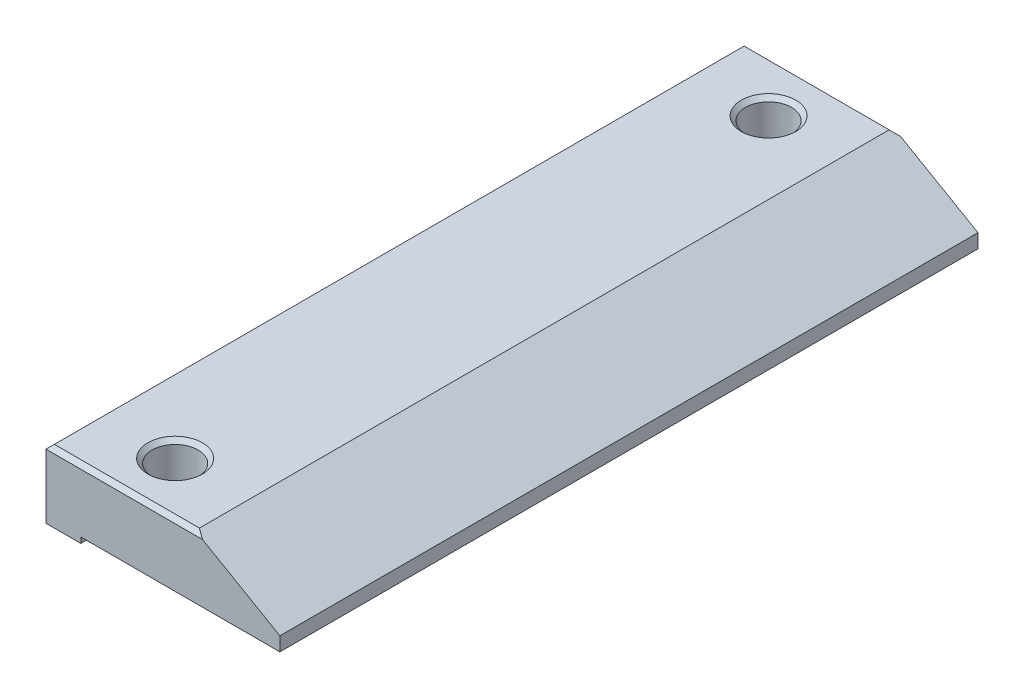
ISO-10303-21;
HEADER;
FILE_DESCRIPTION(('STEP AP214'),'2;1');
FILE_NAME('part.step','',(''),(''),'','','');
FILE_SCHEMA(('AUTOMOTIVE_DESIGN { 1 0 10303 214 1 1 1 1 }'));
ENDSEC;
DATA;
#1=APPLICATION_CONTEXT('core data for automotive mechanical design processes');
#2=APPLICATION_PROTOCOL_DEFINITION('international standard','automotive_design',2000,#1);
#3=PRODUCT_CONTEXT('',#1,'mechanical');
#4=PRODUCT('Part','Part','',(#3));
#5=PRODUCT_RELATED_PRODUCT_CATEGORY('part','',(#4));
#6=PRODUCT_DEFINITION_FORMATION('','',#4);
#7=PRODUCT_DEFINITION_CONTEXT('part definition',#1,'design');
#8=PRODUCT_DEFINITION('design','',#6,#7);
#9=PRODUCT_DEFINITION_SHAPE('','',#8);
#10=(LENGTH_UNIT() NAMED_UNIT(*) SI_UNIT(.MILLI.,.METRE.));
#11=(NAMED_UNIT(*) PLANE_ANGLE_UNIT() SI_UNIT($,.RADIAN.));
#12=(NAMED_UNIT(*) SI_UNIT($,.STERADIAN.) SOLID_ANGLE_UNIT());
#13=UNCERTAINTY_MEASURE_WITH_UNIT(LENGTH_MEASURE(1.E-05),#10,'distance_accuracy_value','');
#14=(GEOMETRIC_REPRESENTATION_CONTEXT(3) GLOBAL_UNCERTAINTY_ASSIGNED_CONTEXT((#13)) GLOBAL_UNIT_ASSIGNED_CONTEXT((#10,
#11,#12)) REPRESENTATION_CONTEXT('',''));
#15=CARTESIAN_POINT('',(0.,0.,0.));
#16=DIRECTION('',(0.,0.,1.));
#17=DIRECTION('',(1.,0.,0.));
#18=AXIS2_PLACEMENT_3D('',#15,#16,#17);
#19=CARTESIAN_POINT('',(-61.,9.8,100.));
#20=DIRECTION('',(1.,0.,0.));
#21=DIRECTION('',(0.,0.,-1.));
#22=AXIS2_PLACEMENT_3D('',#19,#20,#21);
#23=PLANE('',#22);
#24=DIRECTION('',(0.,-1.,0.));
#25=VECTOR('',#24,1.);
#26=CARTESIAN_POINT('',(-61.,9.8,100.));
#27=LINE('',#26,#25);
#28=CARTESIAN_POINT('',(-61.,9.2,100.));
#29=VERTEX_POINT('',#28);
#30=CARTESIAN_POINT('',(-61.,0.,100.));
#31=VERTEX_POINT('',#30);
#32=EDGE_CURVE('E119',#29,#31,#27,.T.);
#33=ORIENTED_EDGE('',*,*,#32,.F.);
#34=DIRECTION('',(0.,0.,-1.));
#35=VECTOR('',#34,1.);
#36=CARTESIAN_POINT('',(-61.,9.2,100.));
#37=LINE('',#36,#35);
#38=CARTESIAN_POINT('',(-61.,9.2,0.));
#39=VERTEX_POINT('',#38);
#40=EDGE_CURVE('E58',#29,#39,#37,.T.);
#41=ORIENTED_EDGE('',*,*,#40,.T.);
#42=DIRECTION('',(0.,-1.,0.));
#43=VECTOR('',#42,1.);
#44=CARTESIAN_POINT('',(-61.,9.8,0.));
#45=LINE('',#44,#43);
#46=CARTESIAN_POINT('',(-61.,0.,0.));
#47=VERTEX_POINT('',#46);
#48=EDGE_CURVE('E141',#39,#47,#45,.T.);
#49=ORIENTED_EDGE('',*,*,#48,.T.);
#50=DIRECTION('',(0.,0.,-1.));
#51=VECTOR('',#50,1.);
#52=CARTESIAN_POINT('',(-61.,0.,100.));
#53=LINE('',#52,#51);
#54=EDGE_CURVE('E133',#31,#47,#53,.T.);
#55=ORIENTED_EDGE('',*,*,#54,.F.);
#56=EDGE_LOOP('',(#33,#41,#49,#55));
#57=FACE_BOUND('',#56,.T.);
#58=ADVANCED_FACE('F47',(#57),#23,.F.);
#59=CARTESIAN_POINT('',(-61.,0.,100.));
#60=DIRECTION('',(0.,1.,0.));
#61=DIRECTION('',(0.,0.,1.));
#62=AXIS2_PLACEMENT_3D('',#59,#60,#61);
#63=PLANE('',#62);
#64=DIRECTION('',(1.,0.,0.));
#65=VECTOR('',#64,1.);
#66=CARTESIAN_POINT('',(-61.,0.,0.));
#67=LINE('',#66,#65);
#68=CARTESIAN_POINT('',(-56.,0.,0.));
#69=VERTEX_POINT('',#68);
#70=EDGE_CURVE('E221',#47,#69,#67,.T.);
#71=ORIENTED_EDGE('',*,*,#70,.T.);
#72=DIRECTION('',(0.,0.,-1.));
#73=VECTOR('',#72,1.);
#74=CARTESIAN_POINT('',(-56.,0.,100.));
#75=LINE('',#74,#73);
#76=CARTESIAN_POINT('',(-56.,0.,100.));
#77=VERTEX_POINT('',#76);
#78=EDGE_CURVE('E135',#77,#69,#75,.T.);
#79=ORIENTED_EDGE('',*,*,#78,.F.);
#80=DIRECTION('',(1.,0.,0.));
#81=VECTOR('',#80,1.);
#82=CARTESIAN_POINT('',(-61.,0.,100.));
#83=LINE('',#82,#81);
#84=EDGE_CURVE('E122',#31,#77,#83,.T.);
#85=ORIENTED_EDGE('',*,*,#84,.F.);
#86=ORIENTED_EDGE('',*,*,#54,.T.);
#87=EDGE_LOOP('',(#71,#79,#85,#86));
#88=FACE_BOUND('',#87,.T.);
#89=ADVANCED_FACE('F132',(#88),#63,.F.);
#90=CARTESIAN_POINT('',(-56.,0.,100.));
#91=DIRECTION('',(-1.,0.,0.));
#92=DIRECTION('',(0.,0.,1.));
#93=AXIS2_PLACEMENT_3D('',#90,#91,#92);
#94=PLANE('',#93);
#95=DIRECTION('',(0.,1.,0.));
#96=VECTOR('',#95,1.);
#97=CARTESIAN_POINT('',(-56.,0.,0.));
#98=LINE('',#97,#96);
#99=CARTESIAN_POINT('',(-56.,0.8,0.));
#100=VERTEX_POINT('',#99);
#101=EDGE_CURVE('E224',#69,#100,#98,.T.);
#102=ORIENTED_EDGE('',*,*,#101,.T.);
#103=DIRECTION('',(0.,0.,-1.));
#104=VECTOR('',#103,1.);
#105=CARTESIAN_POINT('',(-56.,0.8,100.));
#106=LINE('',#105,#104);
#107=CARTESIAN_POINT('',(-56.,0.8,100.));
#108=VERTEX_POINT('',#107);
#109=EDGE_CURVE('E151',#108,#100,#106,.T.);
#110=ORIENTED_EDGE('',*,*,#109,.F.);
#111=DIRECTION('',(0.,1.,0.));
#112=VECTOR('',#111,1.);
#113=CARTESIAN_POINT('',(-56.,0.,100.));
#114=LINE('',#113,#112);
#115=EDGE_CURVE('E138',#77,#108,#114,.T.);
#116=ORIENTED_EDGE('',*,*,#115,.F.);
#117=ORIENTED_EDGE('',*,*,#78,.T.);
#118=EDGE_LOOP('',(#102,#110,#116,#117));
#119=FACE_BOUND('',#118,.T.);
#120=ADVANCED_FACE('F289',(#119),#94,.F.);
#121=CARTESIAN_POINT('',(-56.,0.8,100.));
#122=DIRECTION('',(0.,1.,0.));
#123=DIRECTION('',(0.,0.,1.));
#124=AXIS2_PLACEMENT_3D('',#121,#122,#123);
#125=PLANE('',#124);
#126=CARTESIAN_POINT('',(-50.,0.8,7.5));
#127=DIRECTION('',(0.,1.,0.));
#128=DIRECTION('',(0.,0.,1.));
#129=AXIS2_PLACEMENT_3D('',#126,#127,#128);
#130=CIRCLE('',#129,3.29999999999998);
#131=CARTESIAN_POINT('',(-50.,0.8,10.8));
#132=VERTEX_POINT('',#131);
#133=EDGE_CURVE('E194',#132,#132,#130,.T.);
#134=ORIENTED_EDGE('',*,*,#133,.T.);
#135=EDGE_LOOP('',(#134));
#136=FACE_BOUND('',#135,.T.);
#137=CARTESIAN_POINT('',(-50.,0.8,92.5));
#138=DIRECTION('',(0.,1.,0.));
#139=DIRECTION('',(0.,0.,1.));
#140=AXIS2_PLACEMENT_3D('',#137,#138,#139);
#141=CIRCLE('',#140,3.29999999999998);
#142=CARTESIAN_POINT('',(-50.,0.8,95.8));
#143=VERTEX_POINT('',#142);
#144=EDGE_CURVE('E199',#143,#143,#141,.T.);
#145=ORIENTED_EDGE('',*,*,#144,.T.);
#146=EDGE_LOOP('',(#145));
#147=FACE_BOUND('',#146,.T.);
#148=DIRECTION('',(1.,0.,0.));
#149=VECTOR('',#148,1.);
#150=CARTESIAN_POINT('',(-56.,0.8,0.));
#151=LINE('',#150,#149);
#152=CARTESIAN_POINT('',(-27.5,0.8,0.));
#153=VERTEX_POINT('',#152);
#154=EDGE_CURVE('E227',#100,#153,#151,.T.);
#155=ORIENTED_EDGE('',*,*,#154,.T.);
#156=DIRECTION('',(0.,0.,-1.));
#157=VECTOR('',#156,1.);
#158=CARTESIAN_POINT('',(-27.5,0.8,100.));
#159=LINE('',#158,#157);
#160=CARTESIAN_POINT('',(-27.5,0.8,100.));
#161=VERTEX_POINT('',#160);
#162=EDGE_CURVE('E243',#161,#153,#159,.T.);
#163=ORIENTED_EDGE('',*,*,#162,.F.);
#164=DIRECTION('',(1.,0.,0.));
#165=VECTOR('',#164,1.);
#166=CARTESIAN_POINT('',(-56.,0.8,100.));
#167=LINE('',#166,#165);
#168=EDGE_CURVE('E209',#108,#161,#167,.T.);
#169=ORIENTED_EDGE('',*,*,#168,.F.);
#170=ORIENTED_EDGE('',*,*,#109,.T.);
#171=EDGE_LOOP('',(#155,#163,#169,#170));
#172=FACE_BOUND('',#171,.T.);
#173=ADVANCED_FACE('F252',(#136,#147,#172),#125,.F.);
#174=CARTESIAN_POINT('',(-27.5,0.8,100.));
#175=DIRECTION('',(-1.,0.,0.));
#176=DIRECTION('',(0.,0.,1.));
#177=AXIS2_PLACEMENT_3D('',#174,#175,#176);
#178=PLANE('',#177);
#179=DIRECTION('',(0.,1.,0.));
#180=VECTOR('',#179,1.);
#181=CARTESIAN_POINT('',(-27.5,0.8,0.));
#182=LINE('',#181,#180);
#183=CARTESIAN_POINT('',(-27.5,2.8,0.));
#184=VERTEX_POINT('',#183);
#185=EDGE_CURVE('E230',#153,#184,#182,.T.);
#186=ORIENTED_EDGE('',*,*,#185,.T.);
#187=DIRECTION('',(0.,0.,-1.));
#188=VECTOR('',#187,1.);
#189=CARTESIAN_POINT('',(-27.5,2.8,100.));
#190=LINE('',#189,#188);
#191=CARTESIAN_POINT('',(-27.5,2.8,100.));
#192=VERTEX_POINT('',#191);
#193=EDGE_CURVE('E239',#192,#184,#190,.T.);
#194=ORIENTED_EDGE('',*,*,#193,.F.);
#195=DIRECTION('',(0.,1.,0.));
#196=VECTOR('',#195,1.);
#197=CARTESIAN_POINT('',(-27.5,0.8,100.));
#198=LINE('',#197,#196);
#199=EDGE_CURVE('E212',#161,#192,#198,.T.);
#200=ORIENTED_EDGE('',*,*,#199,.F.);
#201=ORIENTED_EDGE('',*,*,#162,.T.);
#202=EDGE_LOOP('',(#186,#194,#200,#201));
#203=FACE_BOUND('',#202,.T.);
#204=ADVANCED_FACE('F262',(#203),#178,.F.);
#205=CARTESIAN_POINT('',(-27.5,2.8,100.));
#206=DIRECTION('',(-0.500000000000001,-0.866025403784438,0.));
#207=DIRECTION('',(0.866025403784438,-0.500000000000001,0.));
#208=AXIS2_PLACEMENT_3D('',#205,#206,#207);
#209=PLANE('',#208);
#210=DIRECTION('',(-0.866025403784438,0.500000000000001,0.));
#211=VECTOR('',#210,1.);
#212=CARTESIAN_POINT('',(-27.5,2.8,0.));
#213=LINE('',#212,#211);
#214=CARTESIAN_POINT('',(-38.5851251684408,9.2,0.));
#215=VERTEX_POINT('',#214);
#216=EDGE_CURVE('E128',#184,#215,#213,.T.);
#217=ORIENTED_EDGE('',*,*,#216,.T.);
#218=DIRECTION('',(0.774596669241483,-0.447213595499959,-0.447213595499959));
#219=VECTOR('',#218,1.);
#220=CARTESIAN_POINT('',(-39.6243556529821,9.8,0.600000000000003));
#221=LINE('',#220,#219);
#222=CARTESIAN_POINT('',(-39.6243556529821,9.8,0.600000000000003));
#223=VERTEX_POINT('',#222);
#224=EDGE_CURVE('E181',#215,#223,#221,.F.);
#225=ORIENTED_EDGE('',*,*,#224,.T.);
#226=DIRECTION('',(0.,0.,-1.));
#227=VECTOR('',#226,1.);
#228=CARTESIAN_POINT('',(-39.6243556529821,9.8,100.));
#229=LINE('',#228,#227);
#230=CARTESIAN_POINT('',(-39.6243556529821,9.8,99.4));
#231=VERTEX_POINT('',#230);
#232=EDGE_CURVE('E218',#231,#223,#229,.T.);
#233=ORIENTED_EDGE('',*,*,#232,.F.);
#234=DIRECTION('',(0.774596669241483,-0.447213595499959,0.447213595499959));
#235=VECTOR('',#234,1.);
#236=CARTESIAN_POINT('',(-15.4340500673764,-4.16627944162882,113.366279441629));
#237=LINE('',#236,#235);
#238=CARTESIAN_POINT('',(-38.5851251684408,9.2,100.));
#239=VERTEX_POINT('',#238);
#240=EDGE_CURVE('E72',#231,#239,#237,.T.);
#241=ORIENTED_EDGE('',*,*,#240,.T.);
#242=DIRECTION('',(-0.866025403784438,0.500000000000001,0.));
#243=VECTOR('',#242,1.);
#244=CARTESIAN_POINT('',(-27.5,2.8,100.));
#245=LINE('',#244,#243);
#246=EDGE_CURVE('E215',#192,#239,#245,.T.);
#247=ORIENTED_EDGE('',*,*,#246,.F.);
#248=ORIENTED_EDGE('',*,*,#193,.T.);
#249=EDGE_LOOP('',(#217,#225,#233,#241,#247,#248));
#250=FACE_BOUND('',#249,.T.);
#251=ADVANCED_FACE('F264',(#250),#209,.F.);
#252=CARTESIAN_POINT('',(-39.6243556529821,9.8,100.));
#253=DIRECTION('',(0.,-1.,0.));
#254=DIRECTION('',(0.,0.,-1.));
#255=AXIS2_PLACEMENT_3D('',#252,#253,#254);
#256=PLANE('',#255);
#257=CARTESIAN_POINT('',(-50.,9.8,7.5));
#258=DIRECTION('',(0.,-1.,0.));
#259=DIRECTION('',(0.,0.,-1.));
#260=AXIS2_PLACEMENT_3D('',#257,#258,#259);
#261=CIRCLE('',#260,3.89999999999999);
#262=CARTESIAN_POINT('',(-50.,9.8,11.4));
#263=VERTEX_POINT('',#262);
#264=EDGE_CURVE('E168',#263,#263,#261,.T.);
#265=ORIENTED_EDGE('',*,*,#264,.T.);
#266=EDGE_LOOP('',(#265));
#267=FACE_BOUND('',#266,.T.);
#268=CARTESIAN_POINT('',(-50.,9.8,92.5));
#269=DIRECTION('',(0.,-1.,0.));
#270=DIRECTION('',(0.,0.,-1.));
#271=AXIS2_PLACEMENT_3D('',#268,#269,#270);
#272=CIRCLE('',#271,3.89999999999999);
#273=CARTESIAN_POINT('',(-50.,9.8,96.4));
#274=VERTEX_POINT('',#273);
#275=EDGE_CURVE('E164',#274,#274,#272,.T.);
#276=ORIENTED_EDGE('',*,*,#275,.T.);
#277=EDGE_LOOP('',(#276));
#278=FACE_BOUND('',#277,.T.);
#279=ORIENTED_EDGE('',*,*,#232,.T.);
#280=DIRECTION('',(-1.,0.,0.));
#281=VECTOR('',#280,1.);
#282=CARTESIAN_POINT('',(-39.6243556529821,9.8,0.600000000000003));
#283=LINE('',#282,#281);
#284=CARTESIAN_POINT('',(-60.4,9.8,0.600000000000003));
#285=VERTEX_POINT('',#284);
#286=EDGE_CURVE('E160',#223,#285,#283,.T.);
#287=ORIENTED_EDGE('',*,*,#286,.T.);
#288=DIRECTION('',(0.,0.,1.));
#289=VECTOR('',#288,1.);
#290=CARTESIAN_POINT('',(-60.4,9.8,100.));
#291=LINE('',#290,#289);
#292=CARTESIAN_POINT('',(-60.4,9.8,99.4));
#293=VERTEX_POINT('',#292);
#294=EDGE_CURVE('E157',#285,#293,#291,.T.);
#295=ORIENTED_EDGE('',*,*,#294,.T.);
#296=DIRECTION('',(1.,0.,0.));
#297=VECTOR('',#296,1.);
#298=CARTESIAN_POINT('',(-39.6243556529821,9.8,99.4));
#299=LINE('',#298,#297);
#300=EDGE_CURVE('E149',#293,#231,#299,.T.);
#301=ORIENTED_EDGE('',*,*,#300,.T.);
#302=EDGE_LOOP('',(#279,#287,#295,#301));
#303=FACE_BOUND('',#302,.T.);
#304=ADVANCED_FACE('F271',(#267,#278,#303),#256,.F.);
#305=CARTESIAN_POINT('',(0.,0.,100.));
#306=DIRECTION('',(0.,0.,1.));
#307=DIRECTION('',(1.,0.,0.));
#308=AXIS2_PLACEMENT_3D('',#305,#306,#307);
#309=PLANE('',#308);
#310=ORIENTED_EDGE('',*,*,#246,.T.);
#311=DIRECTION('',(-1.,0.,0.));
#312=VECTOR('',#311,1.);
#313=CARTESIAN_POINT('',(-61.,9.2,100.));
#314=LINE('',#313,#312);
#315=EDGE_CURVE('E11',#239,#29,#314,.T.);
#316=ORIENTED_EDGE('',*,*,#315,.T.);
#317=ORIENTED_EDGE('',*,*,#32,.T.);
#318=ORIENTED_EDGE('',*,*,#84,.T.);
#319=ORIENTED_EDGE('',*,*,#115,.T.);
#320=ORIENTED_EDGE('',*,*,#168,.T.);
#321=ORIENTED_EDGE('',*,*,#199,.T.);
#322=EDGE_LOOP('',(#310,#316,#317,#318,#319,#320,#321));
#323=FACE_BOUND('',#322,.T.);
#324=ADVANCED_FACE('F121',(#323),#309,.T.);
#325=CARTESIAN_POINT('',(0.,0.,0.));
#326=DIRECTION('',(0.,0.,1.));
#327=DIRECTION('',(1.,0.,0.));
#328=AXIS2_PLACEMENT_3D('',#325,#326,#327);
#329=PLANE('',#328);
#330=ORIENTED_EDGE('',*,*,#48,.F.);
#331=DIRECTION('',(1.,0.,0.));
#332=VECTOR('',#331,1.);
#333=CARTESIAN_POINT('',(0.,9.2,0.));
#334=LINE('',#333,#332);
#335=EDGE_CURVE('E176',#39,#215,#334,.T.);
#336=ORIENTED_EDGE('',*,*,#335,.T.);
#337=ORIENTED_EDGE('',*,*,#216,.F.);
#338=ORIENTED_EDGE('',*,*,#185,.F.);
#339=ORIENTED_EDGE('',*,*,#154,.F.);
#340=ORIENTED_EDGE('',*,*,#101,.F.);
#341=ORIENTED_EDGE('',*,*,#70,.F.);
#342=EDGE_LOOP('',(#330,#336,#337,#338,#339,#340,#341));
#343=FACE_BOUND('',#342,.T.);
#344=ADVANCED_FACE('F258',(#343),#329,.F.);
#345=CARTESIAN_POINT('',(-50.,9.8,92.5));
#346=DIRECTION('',(0.,1.,0.));
#347=DIRECTION('',(0.,0.,1.));
#348=AXIS2_PLACEMENT_3D('',#345,#346,#347);
#349=CYLINDRICAL_SURFACE('',#348,3.29999999999998);
#350=CARTESIAN_POINT('',(-50.,9.19999999999999,92.5));
#351=DIRECTION('',(0.,-1.,0.));
#352=DIRECTION('',(0.,0.,-1.));
#353=AXIS2_PLACEMENT_3D('',#350,#351,#352);
#354=CIRCLE('',#353,3.29999999999998);
#355=CARTESIAN_POINT('',(-50.,9.19999999999999,95.8));
#356=VERTEX_POINT('',#355);
#357=EDGE_CURVE('E172',#356,#356,#354,.F.);
#358=ORIENTED_EDGE('',*,*,#357,.T.);
#359=EDGE_LOOP('',(#358));
#360=FACE_BOUND('',#359,.T.);
#361=ORIENTED_EDGE('',*,*,#144,.F.);
#362=EDGE_LOOP('',(#361));
#363=FACE_BOUND('',#362,.T.);
#364=ADVANCED_FACE('F338',(#360,#363),#349,.F.);
#365=CARTESIAN_POINT('',(-50.,9.8,7.5));
#366=DIRECTION('',(0.,1.,0.));
#367=DIRECTION('',(0.,0.,1.));
#368=AXIS2_PLACEMENT_3D('',#365,#366,#367);
#369=CYLINDRICAL_SURFACE('',#368,3.29999999999998);
#370=CARTESIAN_POINT('',(-50.,9.19999999999999,7.5));
#371=DIRECTION('',(0.,-1.,0.));
#372=DIRECTION('',(0.,0.,-1.));
#373=AXIS2_PLACEMENT_3D('',#370,#371,#372);
#374=CIRCLE('',#373,3.29999999999998);
#375=CARTESIAN_POINT('',(-50.,9.19999999999999,10.8));
#376=VERTEX_POINT('',#375);
#377=EDGE_CURVE('E144',#376,#376,#374,.F.);
#378=ORIENTED_EDGE('',*,*,#377,.T.);
#379=EDGE_LOOP('',(#378));
#380=FACE_BOUND('',#379,.T.);
#381=ORIENTED_EDGE('',*,*,#133,.F.);
#382=EDGE_LOOP('',(#381));
#383=FACE_BOUND('',#382,.T.);
#384=ADVANCED_FACE('F301',(#380,#383),#369,.F.);
#385=CARTESIAN_POINT('',(-50.,9.19999999999999,7.5));
#386=DIRECTION('',(0.,1.,0.));
#387=DIRECTION('',(0.,0.,1.));
#388=AXIS2_PLACEMENT_3D('',#385,#386,#387);
#389=CONICAL_SURFACE('',#388,3.29999999999998,0.785398163397443);
#390=CARTESIAN_POINT('',(-50.,9.8,11.4));
#391=CARTESIAN_POINT('',(-50.,9.79375,11.39375));
#392=CARTESIAN_POINT('',(-50.,9.7875,11.3875));
#393=CARTESIAN_POINT('',(-50.,9.775,11.375));
#394=CARTESIAN_POINT('',(-50.,9.76875,11.36875));
#395=CARTESIAN_POINT('',(-50.,9.75625,11.35625));
#396=CARTESIAN_POINT('',(-50.,9.75,11.35));
#397=CARTESIAN_POINT('',(-50.,9.7375,11.3375));
#398=CARTESIAN_POINT('',(-50.,9.73125,11.33125));
#399=CARTESIAN_POINT('',(-50.,9.71875,11.31875));
#400=CARTESIAN_POINT('',(-50.,9.7125,11.3125));
#401=CARTESIAN_POINT('',(-50.,9.7,11.3));
#402=CARTESIAN_POINT('',(-50.,9.69375,11.29375));
#403=CARTESIAN_POINT('',(-50.,9.68125,11.28125));
#404=CARTESIAN_POINT('',(-50.,9.675,11.275));
#405=CARTESIAN_POINT('',(-50.,9.6625,11.2625));
#406=CARTESIAN_POINT('',(-50.,9.65625,11.25625));
#407=CARTESIAN_POINT('',(-50.,9.64375,11.24375));
#408=CARTESIAN_POINT('',(-50.,9.6375,11.2375));
#409=CARTESIAN_POINT('',(-50.,9.625,11.225));
#410=CARTESIAN_POINT('',(-50.,9.61875,11.21875));
#411=CARTESIAN_POINT('',(-50.,9.60625,11.20625));
#412=CARTESIAN_POINT('',(-50.,9.6,11.2));
#413=CARTESIAN_POINT('',(-50.,9.5875,11.1875));
#414=CARTESIAN_POINT('',(-50.,9.58125,11.18125));
#415=CARTESIAN_POINT('',(-50.,9.56875,11.16875));
#416=CARTESIAN_POINT('',(-50.,9.5625,11.1625));
#417=CARTESIAN_POINT('',(-50.,9.55,11.15));
#418=CARTESIAN_POINT('',(-50.,9.54375,11.14375));
#419=CARTESIAN_POINT('',(-50.,9.53125,11.13125));
#420=CARTESIAN_POINT('',(-50.,9.525,11.125));
#421=CARTESIAN_POINT('',(-50.,9.5125,11.1125));
#422=CARTESIAN_POINT('',(-50.,9.50625,11.10625));
#423=CARTESIAN_POINT('',(-50.,9.49375,11.09375));
#424=CARTESIAN_POINT('',(-50.,9.4875,11.0875));
#425=CARTESIAN_POINT('',(-50.,9.475,11.075));
#426=CARTESIAN_POINT('',(-50.,9.46875,11.06875));
#427=CARTESIAN_POINT('',(-50.,9.45625,11.05625));
#428=CARTESIAN_POINT('',(-50.,9.45,11.05));
#429=CARTESIAN_POINT('',(-50.,9.4375,11.0375));
#430=CARTESIAN_POINT('',(-50.,9.43125,11.03125));
#431=CARTESIAN_POINT('',(-50.,9.41875,11.01875));
#432=CARTESIAN_POINT('',(-50.,9.4125,11.0125));
#433=CARTESIAN_POINT('',(-50.,9.4,11.));
#434=CARTESIAN_POINT('',(-50.,9.39375,10.99375));
#435=CARTESIAN_POINT('',(-50.,9.38125,10.98125));
#436=CARTESIAN_POINT('',(-50.,9.375,10.975));
#437=CARTESIAN_POINT('',(-50.,9.3625,10.9625));
#438=CARTESIAN_POINT('',(-50.,9.35625,10.95625));
#439=CARTESIAN_POINT('',(-50.,9.34375,10.94375));
#440=CARTESIAN_POINT('',(-50.,9.3375,10.9375));
#441=CARTESIAN_POINT('',(-50.,9.325,10.925));
#442=CARTESIAN_POINT('',(-50.,9.31875,10.91875));
#443=CARTESIAN_POINT('',(-50.,9.30625,10.90625));
#444=CARTESIAN_POINT('',(-50.,9.3,10.9));
#445=CARTESIAN_POINT('',(-50.,9.2875,10.8875));
#446=CARTESIAN_POINT('',(-50.,9.28124999999999,10.88125));
#447=CARTESIAN_POINT('',(-50.,9.26875,10.86875));
#448=CARTESIAN_POINT('',(-50.,9.2625,10.8625));
#449=CARTESIAN_POINT('',(-50.,9.24999999999999,10.85));
#450=CARTESIAN_POINT('',(-50.,9.24375,10.84375));
#451=CARTESIAN_POINT('',(-50.,9.23124999999999,10.83125));
#452=CARTESIAN_POINT('',(-50.,9.22499999999999,10.825));
#453=CARTESIAN_POINT('',(-50.,9.21249999999999,10.8125));
#454=CARTESIAN_POINT('',(-50.,9.20624999999999,10.80625));
#455=CARTESIAN_POINT('',(-50.,9.19999999999999,10.8));
#456=B_SPLINE_CURVE_WITH_KNOTS('',3,(#390,#391,#392,#393,#394,#395,#396,#397,#398,#399,#400,
#401,#402,#403,#404,#405,#406,#407,#408,#409,#410,#411,#412,#413,#414,#415,#416,#417,#418,#419,
#420,#421,#422,#423,#424,#425,#426,#427,#428,#429,#430,#431,#432,#433,#434,#435,#436,#437,#438,
#439,#440,#441,#442,#443,#444,#445,#446,#447,#448,#449,#450,#451,#452,#453,#454,#455),
.UNSPECIFIED.,.F.,.F.,(4,2,2,2,2,2,2,2,2,2,2,2,2,2,2,2,2,2,2,2,2,2,2,2,2,2,2,2,2,2,2,2,4),(0.,
0.0265165042944951,0.0530330085889914,0.0795495128834876,0.106066017177983,0.132582521472479,
0.159099025766975,0.18561553006147,0.212132034355967,0.238648538650463,0.265165042944958,
0.291681547239454,0.318198051533949,0.344714555828446,0.371231060122942,0.397747564417437,
0.424264068711933,0.45078057300643,0.477297077300925,0.503813581595421,0.530330085889916,
0.556846590184412,0.583363094478909,0.609879598773404,0.6363961030679,0.662912607362396,
0.689429111656891,0.715945615951388,0.742462120245883,0.768978624540379,0.795495128834875,
0.82201163312937,0.848528137423868),.UNSPECIFIED.);
#457=EDGE_CURVE('BSEAM294',#263,#376,#456,.T.);
#458=ORIENTED_EDGE('',*,*,#264,.F.);
#459=ORIENTED_EDGE('',*,*,#377,.F.);
#460=ORIENTED_EDGE('',*,*,#457,.T.);
#461=ORIENTED_EDGE('',*,*,#457,.F.);
#462=EDGE_LOOP('',(#458,#460,#459,#461));
#463=FACE_BOUND('',#462,.T.);
#464=ADVANCED_FACE('F294',(#463),#389,.F.);
#465=CARTESIAN_POINT('',(-50.,9.19999999999999,92.5));
#466=DIRECTION('',(0.,1.,0.));
#467=DIRECTION('',(0.,0.,1.));
#468=AXIS2_PLACEMENT_3D('',#465,#466,#467);
#469=CONICAL_SURFACE('',#468,3.29999999999998,0.785398163397443);
#470=CARTESIAN_POINT('',(-50.,9.8,96.4));
#471=CARTESIAN_POINT('',(-50.,9.79375,96.39375));
#472=CARTESIAN_POINT('',(-50.,9.7875,96.3875));
#473=CARTESIAN_POINT('',(-50.,9.775,96.375));
#474=CARTESIAN_POINT('',(-50.,9.76875,96.36875));
#475=CARTESIAN_POINT('',(-50.,9.75625,96.35625));
#476=CARTESIAN_POINT('',(-50.,9.75,96.35));
#477=CARTESIAN_POINT('',(-50.,9.7375,96.3375));
#478=CARTESIAN_POINT('',(-50.,9.73125,96.33125));
#479=CARTESIAN_POINT('',(-50.,9.71875000000001,96.31875));
#480=CARTESIAN_POINT('',(-50.,9.7125,96.3125));
#481=CARTESIAN_POINT('',(-50.,9.7,96.3));
#482=CARTESIAN_POINT('',(-50.,9.69375,96.29375));
#483=CARTESIAN_POINT('',(-50.,9.68125,96.28125));
#484=CARTESIAN_POINT('',(-50.,9.675,96.275));
#485=CARTESIAN_POINT('',(-50.,9.6625,96.2625));
#486=CARTESIAN_POINT('',(-50.,9.65625,96.25625));
#487=CARTESIAN_POINT('',(-50.,9.64375,96.24375));
#488=CARTESIAN_POINT('',(-50.,9.6375,96.2375));
#489=CARTESIAN_POINT('',(-50.,9.625,96.225));
#490=CARTESIAN_POINT('',(-50.,9.61875,96.21875));
#491=CARTESIAN_POINT('',(-50.,9.60625,96.20625));
#492=CARTESIAN_POINT('',(-50.,9.6,96.2));
#493=CARTESIAN_POINT('',(-50.,9.5875,96.1875));
#494=CARTESIAN_POINT('',(-50.,9.58125,96.18125));
#495=CARTESIAN_POINT('',(-50.,9.56875,96.16875));
#496=CARTESIAN_POINT('',(-50.,9.5625,96.1625));
#497=CARTESIAN_POINT('',(-50.,9.55,96.15));
#498=CARTESIAN_POINT('',(-50.,9.54375,96.14375));
#499=CARTESIAN_POINT('',(-50.,9.53125,96.13125));
#500=CARTESIAN_POINT('',(-50.,9.525,96.125));
#501=CARTESIAN_POINT('',(-50.,9.5125,96.1125));
#502=CARTESIAN_POINT('',(-50.,9.50625,96.10625));
#503=CARTESIAN_POINT('',(-50.,9.49375,96.09375));
#504=CARTESIAN_POINT('',(-50.,9.4875,96.0875));
#505=CARTESIAN_POINT('',(-50.,9.475,96.075));
#506=CARTESIAN_POINT('',(-50.,9.46875,96.06875));
#507=CARTESIAN_POINT('',(-50.,9.45625,96.05625));
#508=CARTESIAN_POINT('',(-50.,9.45,96.05));
#509=CARTESIAN_POINT('',(-50.,9.4375,96.0375));
#510=CARTESIAN_POINT('',(-50.,9.43125,96.03125));
#511=CARTESIAN_POINT('',(-50.,9.41875,96.01875));
#512=CARTESIAN_POINT('',(-50.,9.4125,96.0125));
#513=CARTESIAN_POINT('',(-50.,9.4,96.));
#514=CARTESIAN_POINT('',(-50.,9.39375,95.99375));
#515=CARTESIAN_POINT('',(-50.,9.38125,95.98125));
#516=CARTESIAN_POINT('',(-50.,9.375,95.975));
#517=CARTESIAN_POINT('',(-50.,9.3625,95.9625));
#518=CARTESIAN_POINT('',(-50.,9.35625,95.95625));
#519=CARTESIAN_POINT('',(-50.,9.34375,95.94375));
#520=CARTESIAN_POINT('',(-50.,9.3375,95.9375));
#521=CARTESIAN_POINT('',(-50.,9.325,95.925));
#522=CARTESIAN_POINT('',(-50.,9.31875,95.91875));
#523=CARTESIAN_POINT('',(-50.,9.30625,95.90625));
#524=CARTESIAN_POINT('',(-50.,9.3,95.9));
#525=CARTESIAN_POINT('',(-50.,9.2875,95.8875));
#526=CARTESIAN_POINT('',(-50.,9.28124999999999,95.88125));
#527=CARTESIAN_POINT('',(-50.,9.26875,95.86875));
#528=CARTESIAN_POINT('',(-50.,9.26249999999999,95.8625));
#529=CARTESIAN_POINT('',(-50.,9.24999999999999,95.85));
#530=CARTESIAN_POINT('',(-50.,9.24375,95.84375));
#531=CARTESIAN_POINT('',(-50.,9.23124999999999,95.83125));
#532=CARTESIAN_POINT('',(-50.,9.225,95.825));
#533=CARTESIAN_POINT('',(-50.,9.21249999999999,95.8125));
#534=CARTESIAN_POINT('',(-50.,9.20624999999999,95.80625));
#535=CARTESIAN_POINT('',(-50.,9.19999999999999,95.8));
#536=B_SPLINE_CURVE_WITH_KNOTS('',3,(#470,#471,#472,#473,#474,#475,#476,#477,#478,#479,#480,
#481,#482,#483,#484,#485,#486,#487,#488,#489,#490,#491,#492,#493,#494,#495,#496,#497,#498,#499,
#500,#501,#502,#503,#504,#505,#506,#507,#508,#509,#510,#511,#512,#513,#514,#515,#516,#517,#518,
#519,#520,#521,#522,#523,#524,#525,#526,#527,#528,#529,#530,#531,#532,#533,#534,#535),
.UNSPECIFIED.,.F.,.F.,(4,2,2,2,2,2,2,2,2,2,2,2,2,2,2,2,2,2,2,2,2,2,2,2,2,2,2,2,2,2,2,2,4),(0.,
0.0265165042944951,0.0530330085889889,0.079549512883484,0.106066017177988,0.132582521472481,
0.159099025766976,0.18561553006147,0.212132034355964,0.238648538650459,0.265165042944963,
0.291681547239458,0.318198051533952,0.344714555828446,0.371231060122941,0.397747564417435,
0.424264068711928,0.450780573006433,0.477297077300927,0.503813581595422,0.530330085889916,
0.55684659018441,0.583363094478905,0.609879598773409,0.636396103067902,0.662912607362397,
0.689429111656891,0.715945615951386,0.74246212024588,0.768978624540374,0.795495128834879,
0.822011633129373,0.848528137423868),.UNSPECIFIED.);
#537=EDGE_CURVE('BSEAM300',#274,#356,#536,.T.);
#538=ORIENTED_EDGE('',*,*,#275,.F.);
#539=ORIENTED_EDGE('',*,*,#357,.F.);
#540=ORIENTED_EDGE('',*,*,#537,.T.);
#541=ORIENTED_EDGE('',*,*,#537,.F.);
#542=EDGE_LOOP('',(#538,#540,#539,#541));
#543=FACE_BOUND('',#542,.T.);
#544=ADVANCED_FACE('F300',(#543),#469,.F.);
#545=CARTESIAN_POINT('',(0.,9.2,100.));
#546=DIRECTION('',(0.,0.707106781186548,0.707106781186548));
#547=DIRECTION('',(1.,0.,0.));
#548=AXIS2_PLACEMENT_3D('',#545,#546,#547);
#549=PLANE('',#548);
#550=ORIENTED_EDGE('',*,*,#240,.F.);
#551=ORIENTED_EDGE('',*,*,#300,.F.);
#552=DIRECTION('',(0.577350269189626,0.577350269189626,-0.577350269189626));
#553=VECTOR('',#552,1.);
#554=CARTESIAN_POINT('',(-40.6666666666667,29.5333333333333,79.6666666666667));
#555=LINE('',#554,#553);
#556=EDGE_CURVE('E52',#29,#293,#555,.T.);
#557=ORIENTED_EDGE('',*,*,#556,.F.);
#558=ORIENTED_EDGE('',*,*,#315,.F.);
#559=EDGE_LOOP('',(#550,#551,#557,#558));
#560=FACE_BOUND('',#559,.T.);
#561=ADVANCED_FACE('F50',(#560),#549,.T.);
#562=CARTESIAN_POINT('',(-61.,9.2,100.));
#563=DIRECTION('',(0.707106781186548,-0.707106781186548,0.));
#564=DIRECTION('',(0.,0.,-1.));
#565=AXIS2_PLACEMENT_3D('',#562,#563,#564);
#566=PLANE('',#565);
#567=ORIENTED_EDGE('',*,*,#556,.T.);
#568=ORIENTED_EDGE('',*,*,#294,.F.);
#569=DIRECTION('',(-0.577350269189626,-0.577350269189626,-0.577350269189626));
#570=VECTOR('',#569,1.);
#571=CARTESIAN_POINT('',(-27.6666666666667,42.5333333333333,33.3333333333333));
#572=LINE('',#571,#570);
#573=EDGE_CURVE('E185',#39,#285,#572,.F.);
#574=ORIENTED_EDGE('',*,*,#573,.F.);
#575=ORIENTED_EDGE('',*,*,#40,.F.);
#576=EDGE_LOOP('',(#567,#568,#574,#575));
#577=FACE_BOUND('',#576,.T.);
#578=ADVANCED_FACE('F268',(#577),#566,.F.);
#579=CARTESIAN_POINT('',(-39.6243556529821,9.8,0.600000000000003));
#580=DIRECTION('',(0.,-0.707106781186548,0.707106781186548));
#581=DIRECTION('',(-1.,0.,0.));
#582=AXIS2_PLACEMENT_3D('',#579,#580,#581);
#583=PLANE('',#582);
#584=ORIENTED_EDGE('',*,*,#224,.F.);
#585=ORIENTED_EDGE('',*,*,#335,.F.);
#586=ORIENTED_EDGE('',*,*,#573,.T.);
#587=ORIENTED_EDGE('',*,*,#286,.F.);
#588=EDGE_LOOP('',(#584,#585,#586,#587));
#589=FACE_BOUND('',#588,.T.);
#590=ADVANCED_FACE('F269',(#589),#583,.F.);
#591=CLOSED_SHELL('',(#58,#89,#120,#173,#204,#251,#304,#324,#344,#364,#384,#464,#544,#561,#578,#590));
#592=MANIFOLD_SOLID_BREP('B2',#591);
#593=ADVANCED_BREP_SHAPE_REPRESENTATION('',(#18,#592),#14);
#594=SHAPE_DEFINITION_REPRESENTATION(#9,#593);
ENDSEC;
END-ISO-10303-21;
